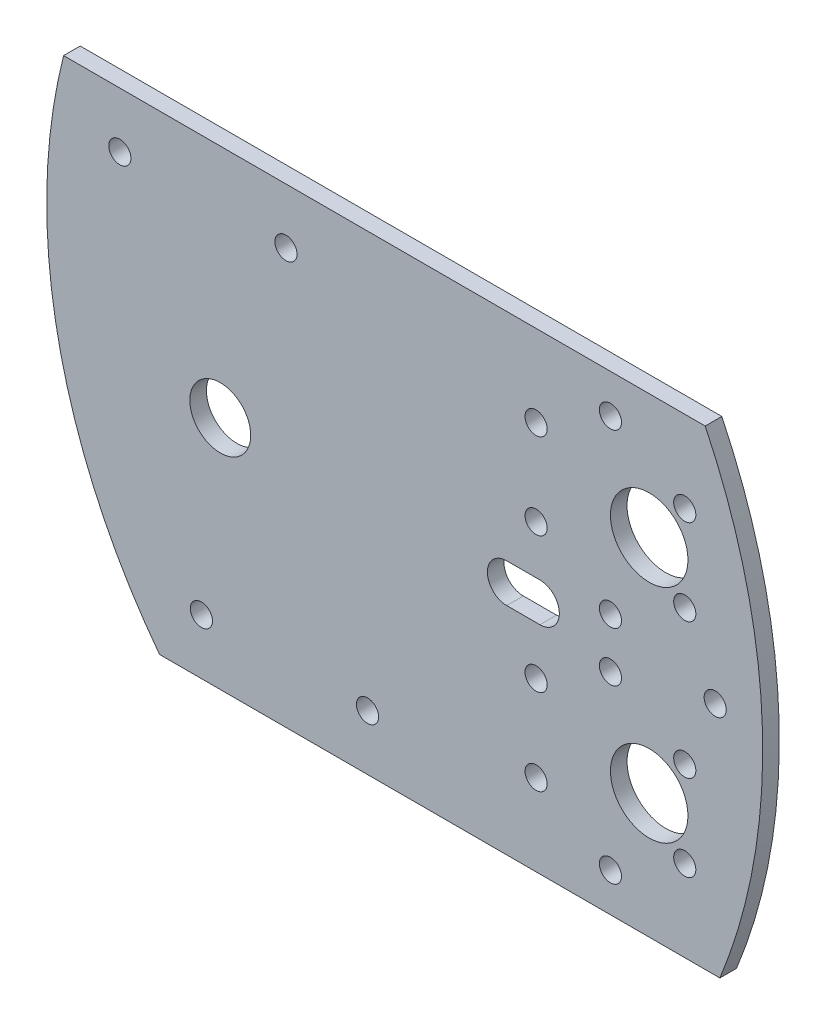
ISO-10303-21;
HEADER;
FILE_DESCRIPTION(('STEP AP214'),'2;1');
FILE_NAME('part.step','',(''),(''),'','','');
FILE_SCHEMA(('AUTOMOTIVE_DESIGN { 1 0 10303 214 1 1 1 1 }'));
ENDSEC;
DATA;
#1=APPLICATION_CONTEXT('core data for automotive mechanical design processes');
#2=APPLICATION_PROTOCOL_DEFINITION('international standard','automotive_design',2000,#1);
#3=PRODUCT_CONTEXT('',#1,'mechanical');
#4=PRODUCT('Part','Part','',(#3));
#5=PRODUCT_RELATED_PRODUCT_CATEGORY('part','',(#4));
#6=PRODUCT_DEFINITION_FORMATION('','',#4);
#7=PRODUCT_DEFINITION_CONTEXT('part definition',#1,'design');
#8=PRODUCT_DEFINITION('design','',#6,#7);
#9=PRODUCT_DEFINITION_SHAPE('','',#8);
#10=(LENGTH_UNIT() NAMED_UNIT(*) SI_UNIT(.MILLI.,.METRE.));
#11=(NAMED_UNIT(*) PLANE_ANGLE_UNIT() SI_UNIT($,.RADIAN.));
#12=(NAMED_UNIT(*) SI_UNIT($,.STERADIAN.) SOLID_ANGLE_UNIT());
#13=UNCERTAINTY_MEASURE_WITH_UNIT(LENGTH_MEASURE(1.E-05),#10,'distance_accuracy_value','');
#14=(GEOMETRIC_REPRESENTATION_CONTEXT(3) GLOBAL_UNCERTAINTY_ASSIGNED_CONTEXT((#13)) GLOBAL_UNIT_ASSIGNED_CONTEXT((#10,
#11,#12)) REPRESENTATION_CONTEXT('',''));
#15=CARTESIAN_POINT('',(0.,0.,0.));
#16=DIRECTION('',(0.,0.,1.));
#17=DIRECTION('',(1.,0.,0.));
#18=AXIS2_PLACEMENT_3D('',#15,#16,#17);
#19=CARTESIAN_POINT('',(87.2720779386423,0.,53.));
#20=DIRECTION('',(0.,0.,-1.));
#21=DIRECTION('',(-1.,0.,0.));
#22=AXIS2_PLACEMENT_3D('',#19,#20,#21);
#23=CYLINDRICAL_SURFACE('',#22,3.5);
#24=CARTESIAN_POINT('',(87.2720779386423,0.,50.));
#25=DIRECTION('',(0.,0.,1.));
#26=DIRECTION('',(1.,0.,0.));
#27=AXIS2_PLACEMENT_3D('',#24,#25,#26);
#28=CIRCLE('',#27,3.5);
#29=CARTESIAN_POINT('',(87.2720779386423,-3.5,50.));
#30=VERTEX_POINT('',#29);
#31=CARTESIAN_POINT('',(87.2720779386423,3.5,50.));
#32=VERTEX_POINT('',#31);
#33=EDGE_CURVE('E202',#30,#32,#28,.T.);
#34=ORIENTED_EDGE('',*,*,#33,.F.);
#35=DIRECTION('',(0.,0.,-1.));
#36=VECTOR('',#35,1.);
#37=CARTESIAN_POINT('',(87.2720779386423,-3.5,53.));
#38=LINE('',#37,#36);
#39=CARTESIAN_POINT('',(87.2720779386423,-3.5,53.));
#40=VERTEX_POINT('',#39);
#41=EDGE_CURVE('E11',#40,#30,#38,.T.);
#42=ORIENTED_EDGE('',*,*,#41,.F.);
#43=CARTESIAN_POINT('',(87.2720779386423,0.,53.));
#44=DIRECTION('',(0.,0.,1.));
#45=DIRECTION('',(1.,0.,0.));
#46=AXIS2_PLACEMENT_3D('',#43,#44,#45);
#47=CIRCLE('',#46,3.5);
#48=CARTESIAN_POINT('',(87.2720779386423,3.5,53.));
#49=VERTEX_POINT('',#48);
#50=EDGE_CURVE('E125',#40,#49,#47,.T.);
#51=ORIENTED_EDGE('',*,*,#50,.T.);
#52=DIRECTION('',(0.,0.,-1.));
#53=VECTOR('',#52,1.);
#54=CARTESIAN_POINT('',(87.2720779386423,3.5,53.));
#55=LINE('',#54,#53);
#56=EDGE_CURVE('E88',#49,#32,#55,.T.);
#57=ORIENTED_EDGE('',*,*,#56,.T.);
#58=EDGE_LOOP('',(#34,#42,#51,#57));
#59=FACE_BOUND('',#58,.T.);
#60=ADVANCED_FACE('F35',(#59),#23,.F.);
#61=CARTESIAN_POINT('',(0.,-3.5,53.));
#62=DIRECTION('',(0.,1.,0.));
#63=DIRECTION('',(0.,0.,1.));
#64=AXIS2_PLACEMENT_3D('',#61,#62,#63);
#65=PLANE('',#64);
#66=DIRECTION('',(1.,0.,0.));
#67=VECTOR('',#66,1.);
#68=CARTESIAN_POINT('',(0.,-3.5,50.));
#69=LINE('',#68,#67);
#70=CARTESIAN_POINT('',(81.2720779386423,-3.5,50.));
#71=VERTEX_POINT('',#70);
#72=EDGE_CURVE('E116',#71,#30,#69,.T.);
#73=ORIENTED_EDGE('',*,*,#72,.F.);
#74=DIRECTION('',(0.,0.,-1.));
#75=VECTOR('',#74,1.);
#76=CARTESIAN_POINT('',(81.2720779386423,-3.5,53.));
#77=LINE('',#76,#75);
#78=CARTESIAN_POINT('',(81.2720779386423,-3.5,53.));
#79=VERTEX_POINT('',#78);
#80=EDGE_CURVE('E45',#79,#71,#77,.T.);
#81=ORIENTED_EDGE('',*,*,#80,.F.);
#82=DIRECTION('',(1.,0.,0.));
#83=VECTOR('',#82,1.);
#84=CARTESIAN_POINT('',(0.,-3.5,53.));
#85=LINE('',#84,#83);
#86=EDGE_CURVE('E114',#79,#40,#85,.T.);
#87=ORIENTED_EDGE('',*,*,#86,.T.);
#88=ORIENTED_EDGE('',*,*,#41,.T.);
#89=EDGE_LOOP('',(#73,#81,#87,#88));
#90=FACE_BOUND('',#89,.T.);
#91=ADVANCED_FACE('F113',(#90),#65,.T.);
#92=CARTESIAN_POINT('',(81.2720779386423,0.,53.));
#93=DIRECTION('',(0.,0.,-1.));
#94=DIRECTION('',(-1.,0.,0.));
#95=AXIS2_PLACEMENT_3D('',#92,#93,#94);
#96=CYLINDRICAL_SURFACE('',#95,3.5);
#97=CARTESIAN_POINT('',(81.2720779386423,0.,50.));
#98=DIRECTION('',(0.,0.,1.));
#99=DIRECTION('',(1.,0.,0.));
#100=AXIS2_PLACEMENT_3D('',#97,#98,#99);
#101=CIRCLE('',#100,3.5);
#102=CARTESIAN_POINT('',(81.2720779386423,3.5,50.));
#103=VERTEX_POINT('',#102);
#104=EDGE_CURVE('E206',#103,#71,#101,.T.);
#105=ORIENTED_EDGE('',*,*,#104,.F.);
#106=DIRECTION('',(0.,0.,-1.));
#107=VECTOR('',#106,1.);
#108=CARTESIAN_POINT('',(81.2720779386423,3.5,53.));
#109=LINE('',#108,#107);
#110=CARTESIAN_POINT('',(81.2720779386423,3.5,53.));
#111=VERTEX_POINT('',#110);
#112=EDGE_CURVE('E81',#111,#103,#109,.T.);
#113=ORIENTED_EDGE('',*,*,#112,.F.);
#114=CARTESIAN_POINT('',(81.2720779386423,0.,53.));
#115=DIRECTION('',(0.,0.,1.));
#116=DIRECTION('',(1.,0.,0.));
#117=AXIS2_PLACEMENT_3D('',#114,#115,#116);
#118=CIRCLE('',#117,3.5);
#119=EDGE_CURVE('E124',#111,#79,#118,.T.);
#120=ORIENTED_EDGE('',*,*,#119,.T.);
#121=ORIENTED_EDGE('',*,*,#80,.T.);
#122=EDGE_LOOP('',(#105,#113,#120,#121));
#123=FACE_BOUND('',#122,.T.);
#124=ADVANCED_FACE('F127',(#123),#96,.F.);
#125=CARTESIAN_POINT('',(0.,-42.5,53.));
#126=DIRECTION('',(0.,1.,0.));
#127=DIRECTION('',(-1.,0.,0.));
#128=AXIS2_PLACEMENT_3D('',#125,#126,#127);
#129=PLANE('',#128);
#130=DIRECTION('',(1.,0.,0.));
#131=VECTOR('',#130,1.);
#132=CARTESIAN_POINT('',(0.,-42.5,50.));
#133=LINE('',#132,#131);
#134=CARTESIAN_POINT('',(18.5774529420215,-42.5,50.));
#135=VERTEX_POINT('',#134);
#136=CARTESIAN_POINT('',(119.771431791704,-42.5000000000001,50.));
#137=VERTEX_POINT('',#136);
#138=EDGE_CURVE('E193',#135,#137,#133,.T.);
#139=ORIENTED_EDGE('',*,*,#138,.T.);
#140=DIRECTION('',(0.,0.,-1.));
#141=VECTOR('',#140,1.);
#142=CARTESIAN_POINT('',(119.771431791704,-42.5000000000001,53.));
#143=LINE('',#142,#141);
#144=CARTESIAN_POINT('',(119.771431791704,-42.5000000000001,53.));
#145=VERTEX_POINT('',#144);
#146=EDGE_CURVE('E39',#145,#137,#143,.T.);
#147=ORIENTED_EDGE('',*,*,#146,.F.);
#148=DIRECTION('',(1.,0.,0.));
#149=VECTOR('',#148,1.);
#150=CARTESIAN_POINT('',(0.,-42.5,53.));
#151=LINE('',#150,#149);
#152=CARTESIAN_POINT('',(18.5774529420215,-42.5,53.));
#153=VERTEX_POINT('',#152);
#154=EDGE_CURVE('E296',#153,#145,#151,.T.);
#155=ORIENTED_EDGE('',*,*,#154,.F.);
#156=DIRECTION('',(0.,0.,-1.));
#157=VECTOR('',#156,1.);
#158=CARTESIAN_POINT('',(18.5774529420215,-42.5,53.));
#159=LINE('',#158,#157);
#160=EDGE_CURVE('E183',#153,#135,#159,.T.);
#161=ORIENTED_EDGE('',*,*,#160,.T.);
#162=EDGE_LOOP('',(#139,#147,#155,#161));
#163=FACE_BOUND('',#162,.T.);
#164=ADVANCED_FACE('F278',(#163),#129,.F.);
#165=CARTESIAN_POINT('',(22.6589151875398,-2.99288439458776,53.));
#166=DIRECTION('',(0.,0.,-1.));
#167=DIRECTION('',(-1.,0.,0.));
#168=AXIS2_PLACEMENT_3D('',#165,#166,#167);
#169=CYLINDRICAL_SURFACE('',#168,104.84108481246);
#170=CARTESIAN_POINT('',(22.6589151875398,-2.99288439458776,50.));
#171=DIRECTION('',(0.,0.,1.));
#172=DIRECTION('',(1.,0.,0.));
#173=AXIS2_PLACEMENT_3D('',#170,#171,#172);
#174=CIRCLE('',#173,104.84108481246);
#175=CARTESIAN_POINT('',(117.115521807268,42.5,50.));
#176=VERTEX_POINT('',#175);
#177=EDGE_CURVE('E196',#137,#176,#174,.T.);
#178=ORIENTED_EDGE('',*,*,#177,.T.);
#179=DIRECTION('',(0.,0.,-1.));
#180=VECTOR('',#179,1.);
#181=CARTESIAN_POINT('',(117.115521807268,42.5,53.));
#182=LINE('',#181,#180);
#183=CARTESIAN_POINT('',(117.115521807268,42.5,53.));
#184=VERTEX_POINT('',#183);
#185=EDGE_CURVE('E268',#184,#176,#182,.T.);
#186=ORIENTED_EDGE('',*,*,#185,.F.);
#187=CARTESIAN_POINT('',(22.6589151875398,-2.99288439458776,53.));
#188=DIRECTION('',(0.,0.,1.));
#189=DIRECTION('',(1.,0.,0.));
#190=AXIS2_PLACEMENT_3D('',#187,#188,#189);
#191=CIRCLE('',#190,104.84108481246);
#192=EDGE_CURVE('E96',#145,#184,#191,.T.);
#193=ORIENTED_EDGE('',*,*,#192,.F.);
#194=ORIENTED_EDGE('',*,*,#146,.T.);
#195=EDGE_LOOP('',(#178,#186,#193,#194));
#196=FACE_BOUND('',#195,.T.);
#197=ADVANCED_FACE('F274',(#196),#169,.T.);
#198=CARTESIAN_POINT('',(0.,42.5,53.));
#199=DIRECTION('',(0.,-1.,0.));
#200=DIRECTION('',(1.,0.,0.));
#201=AXIS2_PLACEMENT_3D('',#198,#199,#200);
#202=PLANE('',#201);
#203=DIRECTION('',(-1.,0.,0.));
#204=VECTOR('',#203,1.);
#205=CARTESIAN_POINT('',(0.,42.5,50.));
#206=LINE('',#205,#204);
#207=CARTESIAN_POINT('',(1.24769213680372,42.5,50.));
#208=VERTEX_POINT('',#207);
#209=EDGE_CURVE('E198',#176,#208,#206,.T.);
#210=ORIENTED_EDGE('',*,*,#209,.T.);
#211=DIRECTION('',(0.,0.,-1.));
#212=VECTOR('',#211,1.);
#213=CARTESIAN_POINT('',(1.24769213680372,42.5,53.));
#214=LINE('',#213,#212);
#215=CARTESIAN_POINT('',(1.24769213680372,42.5,53.));
#216=VERTEX_POINT('',#215);
#217=EDGE_CURVE('E266',#216,#208,#214,.T.);
#218=ORIENTED_EDGE('',*,*,#217,.F.);
#219=DIRECTION('',(-1.,0.,0.));
#220=VECTOR('',#219,1.);
#221=CARTESIAN_POINT('',(0.,42.5,53.));
#222=LINE('',#221,#220);
#223=EDGE_CURVE('E291',#184,#216,#222,.T.);
#224=ORIENTED_EDGE('',*,*,#223,.F.);
#225=ORIENTED_EDGE('',*,*,#185,.T.);
#226=EDGE_LOOP('',(#210,#218,#224,#225));
#227=FACE_BOUND('',#226,.T.);
#228=ADVANCED_FACE('F285',(#227),#202,.F.);
#229=CARTESIAN_POINT('',(100.,4.50000000000001,53.));
#230=DIRECTION('',(0.,0.,-1.));
#231=DIRECTION('',(-1.,0.,0.));
#232=AXIS2_PLACEMENT_3D('',#229,#230,#231);
#233=CYLINDRICAL_SURFACE('',#232,2.);
#234=CARTESIAN_POINT('',(100.,4.50000000000001,53.));
#235=DIRECTION('',(0.,0.,1.));
#236=DIRECTION('',(1.,0.,0.));
#237=AXIS2_PLACEMENT_3D('',#234,#235,#236);
#238=CIRCLE('',#237,2.);
#239=CARTESIAN_POINT('',(102.,4.50000000000001,53.));
#240=VERTEX_POINT('',#239);
#241=EDGE_CURVE('E177',#240,#240,#238,.T.);
#242=ORIENTED_EDGE('',*,*,#241,.T.);
#243=EDGE_LOOP('',(#242));
#244=FACE_BOUND('',#243,.T.);
#245=CARTESIAN_POINT('',(100.,4.50000000000001,50.));
#246=DIRECTION('',(0.,0.,1.));
#247=DIRECTION('',(1.,0.,0.));
#248=AXIS2_PLACEMENT_3D('',#245,#246,#247);
#249=CIRCLE('',#248,2.);
#250=CARTESIAN_POINT('',(102.,4.50000000000001,50.));
#251=VERTEX_POINT('',#250);
#252=EDGE_CURVE('E255',#251,#251,#249,.T.);
#253=ORIENTED_EDGE('',*,*,#252,.F.);
#254=EDGE_LOOP('',(#253));
#255=FACE_BOUND('',#254,.T.);
#256=ADVANCED_FACE('F344',(#244,#255),#233,.F.);
#257=CARTESIAN_POINT('',(86.5766062413412,27.7499999999999,53.));
#258=DIRECTION('',(0.,0.,-1.));
#259=DIRECTION('',(-1.,0.,0.));
#260=AXIS2_PLACEMENT_3D('',#257,#258,#259);
#261=CYLINDRICAL_SURFACE('',#260,2.);
#262=CARTESIAN_POINT('',(86.5766062413412,27.7499999999999,53.));
#263=DIRECTION('',(0.,0.,1.));
#264=DIRECTION('',(1.,0.,0.));
#265=AXIS2_PLACEMENT_3D('',#262,#263,#264);
#266=CIRCLE('',#265,2.);
#267=CARTESIAN_POINT('',(88.5766062413412,27.7499999999999,53.));
#268=VERTEX_POINT('',#267);
#269=EDGE_CURVE('E174',#268,#268,#266,.T.);
#270=ORIENTED_EDGE('',*,*,#269,.T.);
#271=EDGE_LOOP('',(#270));
#272=FACE_BOUND('',#271,.T.);
#273=CARTESIAN_POINT('',(86.5766062413412,27.7499999999999,50.));
#274=DIRECTION('',(0.,0.,1.));
#275=DIRECTION('',(1.,0.,0.));
#276=AXIS2_PLACEMENT_3D('',#273,#274,#275);
#277=CIRCLE('',#276,2.);
#278=CARTESIAN_POINT('',(88.5766062413412,27.7499999999999,50.));
#279=VERTEX_POINT('',#278);
#280=EDGE_CURVE('E252',#279,#279,#277,.T.);
#281=ORIENTED_EDGE('',*,*,#280,.F.);
#282=EDGE_LOOP('',(#281));
#283=FACE_BOUND('',#282,.T.);
#284=ADVANCED_FACE('F365',(#272,#283),#261,.F.);
#285=CARTESIAN_POINT('',(86.5766062413413,12.2499999999999,53.));
#286=DIRECTION('',(0.,0.,-1.));
#287=DIRECTION('',(-1.,0.,0.));
#288=AXIS2_PLACEMENT_3D('',#285,#286,#287);
#289=CYLINDRICAL_SURFACE('',#288,2.);
#290=CARTESIAN_POINT('',(86.5766062413413,12.2499999999999,53.));
#291=DIRECTION('',(0.,0.,1.));
#292=DIRECTION('',(1.,0.,0.));
#293=AXIS2_PLACEMENT_3D('',#290,#291,#292);
#294=CIRCLE('',#293,2.);
#295=CARTESIAN_POINT('',(88.5766062413413,12.2499999999999,53.));
#296=VERTEX_POINT('',#295);
#297=EDGE_CURVE('E171',#296,#296,#294,.T.);
#298=ORIENTED_EDGE('',*,*,#297,.T.);
#299=EDGE_LOOP('',(#298));
#300=FACE_BOUND('',#299,.T.);
#301=CARTESIAN_POINT('',(86.5766062413413,12.2499999999999,50.));
#302=DIRECTION('',(0.,0.,1.));
#303=DIRECTION('',(1.,0.,0.));
#304=AXIS2_PLACEMENT_3D('',#301,#302,#303);
#305=CIRCLE('',#304,2.);
#306=CARTESIAN_POINT('',(88.5766062413413,12.2499999999999,50.));
#307=VERTEX_POINT('',#306);
#308=EDGE_CURVE('E249',#307,#307,#305,.T.);
#309=ORIENTED_EDGE('',*,*,#308,.F.);
#310=EDGE_LOOP('',(#309));
#311=FACE_BOUND('',#310,.T.);
#312=ADVANCED_FACE('F369',(#300,#311),#289,.F.);
#313=CARTESIAN_POINT('',(99.9999999999999,35.5,53.));
#314=DIRECTION('',(0.,0.,-1.));
#315=DIRECTION('',(-1.,0.,0.));
#316=AXIS2_PLACEMENT_3D('',#313,#314,#315);
#317=CYLINDRICAL_SURFACE('',#316,2.);
#318=CARTESIAN_POINT('',(99.9999999999999,35.5,53.));
#319=DIRECTION('',(0.,0.,1.));
#320=DIRECTION('',(1.,0.,0.));
#321=AXIS2_PLACEMENT_3D('',#318,#319,#320);
#322=CIRCLE('',#321,2.);
#323=CARTESIAN_POINT('',(102.,35.5,53.));
#324=VERTEX_POINT('',#323);
#325=EDGE_CURVE('E168',#324,#324,#322,.T.);
#326=ORIENTED_EDGE('',*,*,#325,.T.);
#327=EDGE_LOOP('',(#326));
#328=FACE_BOUND('',#327,.T.);
#329=CARTESIAN_POINT('',(99.9999999999999,35.5,50.));
#330=DIRECTION('',(0.,0.,1.));
#331=DIRECTION('',(1.,0.,0.));
#332=AXIS2_PLACEMENT_3D('',#329,#330,#331);
#333=CIRCLE('',#332,2.);
#334=CARTESIAN_POINT('',(102.,35.5,50.));
#335=VERTEX_POINT('',#334);
#336=EDGE_CURVE('E246',#335,#335,#333,.T.);
#337=ORIENTED_EDGE('',*,*,#336,.F.);
#338=EDGE_LOOP('',(#337));
#339=FACE_BOUND('',#338,.T.);
#340=ADVANCED_FACE('F373',(#328,#339),#317,.F.);
#341=CARTESIAN_POINT('',(113.423393758659,27.7500000000001,53.));
#342=DIRECTION('',(0.,0.,-1.));
#343=DIRECTION('',(-1.,0.,0.));
#344=AXIS2_PLACEMENT_3D('',#341,#342,#343);
#345=CYLINDRICAL_SURFACE('',#344,2.);
#346=CARTESIAN_POINT('',(113.423393758659,27.7500000000001,53.));
#347=DIRECTION('',(0.,0.,1.));
#348=DIRECTION('',(1.,0.,0.));
#349=AXIS2_PLACEMENT_3D('',#346,#347,#348);
#350=CIRCLE('',#349,2.);
#351=CARTESIAN_POINT('',(115.423393758659,27.7500000000001,53.));
#352=VERTEX_POINT('',#351);
#353=EDGE_CURVE('E165',#352,#352,#350,.T.);
#354=ORIENTED_EDGE('',*,*,#353,.T.);
#355=EDGE_LOOP('',(#354));
#356=FACE_BOUND('',#355,.T.);
#357=CARTESIAN_POINT('',(113.423393758659,27.7500000000001,50.));
#358=DIRECTION('',(0.,0.,1.));
#359=DIRECTION('',(1.,0.,0.));
#360=AXIS2_PLACEMENT_3D('',#357,#358,#359);
#361=CIRCLE('',#360,2.);
#362=CARTESIAN_POINT('',(115.423393758659,27.7500000000001,50.));
#363=VERTEX_POINT('',#362);
#364=EDGE_CURVE('E243',#363,#363,#361,.T.);
#365=ORIENTED_EDGE('',*,*,#364,.F.);
#366=EDGE_LOOP('',(#365));
#367=FACE_BOUND('',#366,.T.);
#368=ADVANCED_FACE('F377',(#356,#367),#345,.F.);
#369=CARTESIAN_POINT('',(107.,20.,53.));
#370=DIRECTION('',(0.,0.,-1.));
#371=DIRECTION('',(-1.,0.,0.));
#372=AXIS2_PLACEMENT_3D('',#369,#370,#371);
#373=CYLINDRICAL_SURFACE('',#372,7.);
#374=CARTESIAN_POINT('',(107.,20.,53.));
#375=DIRECTION('',(0.,0.,1.));
#376=DIRECTION('',(1.,0.,0.));
#377=AXIS2_PLACEMENT_3D('',#374,#375,#376);
#378=CIRCLE('',#377,7.);
#379=CARTESIAN_POINT('',(114.,20.,53.));
#380=VERTEX_POINT('',#379);
#381=EDGE_CURVE('E162',#380,#380,#378,.T.);
#382=ORIENTED_EDGE('',*,*,#381,.T.);
#383=EDGE_LOOP('',(#382));
#384=FACE_BOUND('',#383,.T.);
#385=CARTESIAN_POINT('',(107.,20.,50.));
#386=DIRECTION('',(0.,0.,1.));
#387=DIRECTION('',(1.,0.,0.));
#388=AXIS2_PLACEMENT_3D('',#385,#386,#387);
#389=CIRCLE('',#388,7.);
#390=CARTESIAN_POINT('',(114.,20.,50.));
#391=VERTEX_POINT('',#390);
#392=EDGE_CURVE('E240',#391,#391,#389,.T.);
#393=ORIENTED_EDGE('',*,*,#392,.F.);
#394=EDGE_LOOP('',(#393));
#395=FACE_BOUND('',#394,.T.);
#396=ADVANCED_FACE('F381',(#384,#395),#373,.F.);
#397=CARTESIAN_POINT('',(107.,-20.,53.));
#398=DIRECTION('',(0.,0.,-1.));
#399=DIRECTION('',(-1.,0.,0.));
#400=AXIS2_PLACEMENT_3D('',#397,#398,#399);
#401=CYLINDRICAL_SURFACE('',#400,7.);
#402=CARTESIAN_POINT('',(107.,-20.,53.));
#403=DIRECTION('',(0.,0.,1.));
#404=DIRECTION('',(1.,0.,0.));
#405=AXIS2_PLACEMENT_3D('',#402,#403,#404);
#406=CIRCLE('',#405,7.);
#407=CARTESIAN_POINT('',(114.,-20.,53.));
#408=VERTEX_POINT('',#407);
#409=EDGE_CURVE('E159',#408,#408,#406,.T.);
#410=ORIENTED_EDGE('',*,*,#409,.T.);
#411=EDGE_LOOP('',(#410));
#412=FACE_BOUND('',#411,.T.);
#413=CARTESIAN_POINT('',(107.,-20.,50.));
#414=DIRECTION('',(0.,0.,1.));
#415=DIRECTION('',(1.,0.,0.));
#416=AXIS2_PLACEMENT_3D('',#413,#414,#415);
#417=CIRCLE('',#416,7.);
#418=CARTESIAN_POINT('',(114.,-20.,50.));
#419=VERTEX_POINT('',#418);
#420=EDGE_CURVE('E237',#419,#419,#417,.T.);
#421=ORIENTED_EDGE('',*,*,#420,.F.);
#422=EDGE_LOOP('',(#421));
#423=FACE_BOUND('',#422,.T.);
#424=ADVANCED_FACE('F385',(#412,#423),#401,.F.);
#425=CARTESIAN_POINT('',(100.,-35.5,53.));
#426=DIRECTION('',(0.,0.,-1.));
#427=DIRECTION('',(-1.,0.,0.));
#428=AXIS2_PLACEMENT_3D('',#425,#426,#427);
#429=CYLINDRICAL_SURFACE('',#428,2.);
#430=CARTESIAN_POINT('',(100.,-35.5,53.));
#431=DIRECTION('',(0.,0.,1.));
#432=DIRECTION('',(1.,0.,0.));
#433=AXIS2_PLACEMENT_3D('',#430,#431,#432);
#434=CIRCLE('',#433,2.);
#435=CARTESIAN_POINT('',(102.,-35.5,53.));
#436=VERTEX_POINT('',#435);
#437=EDGE_CURVE('E156',#436,#436,#434,.T.);
#438=ORIENTED_EDGE('',*,*,#437,.T.);
#439=EDGE_LOOP('',(#438));
#440=FACE_BOUND('',#439,.T.);
#441=CARTESIAN_POINT('',(100.,-35.5,50.));
#442=DIRECTION('',(0.,0.,1.));
#443=DIRECTION('',(1.,0.,0.));
#444=AXIS2_PLACEMENT_3D('',#441,#442,#443);
#445=CIRCLE('',#444,2.);
#446=CARTESIAN_POINT('',(102.,-35.5,50.));
#447=VERTEX_POINT('',#446);
#448=EDGE_CURVE('E234',#447,#447,#445,.T.);
#449=ORIENTED_EDGE('',*,*,#448,.F.);
#450=EDGE_LOOP('',(#449));
#451=FACE_BOUND('',#450,.T.);
#452=ADVANCED_FACE('F389',(#440,#451),#429,.F.);
#453=CARTESIAN_POINT('',(86.5766062413413,-27.7500000000001,53.));
#454=DIRECTION('',(0.,0.,-1.));
#455=DIRECTION('',(-1.,0.,0.));
#456=AXIS2_PLACEMENT_3D('',#453,#454,#455);
#457=CYLINDRICAL_SURFACE('',#456,2.);
#458=CARTESIAN_POINT('',(86.5766062413413,-27.7500000000001,53.));
#459=DIRECTION('',(0.,0.,1.));
#460=DIRECTION('',(1.,0.,0.));
#461=AXIS2_PLACEMENT_3D('',#458,#459,#460);
#462=CIRCLE('',#461,2.);
#463=CARTESIAN_POINT('',(88.5766062413413,-27.7500000000001,53.));
#464=VERTEX_POINT('',#463);
#465=EDGE_CURVE('E153',#464,#464,#462,.T.);
#466=ORIENTED_EDGE('',*,*,#465,.T.);
#467=EDGE_LOOP('',(#466));
#468=FACE_BOUND('',#467,.T.);
#469=CARTESIAN_POINT('',(86.5766062413413,-27.7500000000001,50.));
#470=DIRECTION('',(0.,0.,1.));
#471=DIRECTION('',(1.,0.,0.));
#472=AXIS2_PLACEMENT_3D('',#469,#470,#471);
#473=CIRCLE('',#472,2.);
#474=CARTESIAN_POINT('',(88.5766062413413,-27.7500000000001,50.));
#475=VERTEX_POINT('',#474);
#476=EDGE_CURVE('E231',#475,#475,#473,.T.);
#477=ORIENTED_EDGE('',*,*,#476,.F.);
#478=EDGE_LOOP('',(#477));
#479=FACE_BOUND('',#478,.T.);
#480=ADVANCED_FACE('F393',(#468,#479),#457,.F.);
#481=CARTESIAN_POINT('',(86.5766062413412,-12.2500000000001,53.));
#482=DIRECTION('',(0.,0.,-1.));
#483=DIRECTION('',(-1.,0.,0.));
#484=AXIS2_PLACEMENT_3D('',#481,#482,#483);
#485=CYLINDRICAL_SURFACE('',#484,2.);
#486=CARTESIAN_POINT('',(86.5766062413412,-12.2500000000001,53.));
#487=DIRECTION('',(0.,0.,1.));
#488=DIRECTION('',(1.,0.,0.));
#489=AXIS2_PLACEMENT_3D('',#486,#487,#488);
#490=CIRCLE('',#489,2.);
#491=CARTESIAN_POINT('',(88.5766062413412,-12.2500000000001,53.));
#492=VERTEX_POINT('',#491);
#493=EDGE_CURVE('E150',#492,#492,#490,.T.);
#494=ORIENTED_EDGE('',*,*,#493,.T.);
#495=EDGE_LOOP('',(#494));
#496=FACE_BOUND('',#495,.T.);
#497=CARTESIAN_POINT('',(86.5766062413412,-12.2500000000001,50.));
#498=DIRECTION('',(0.,0.,1.));
#499=DIRECTION('',(1.,0.,0.));
#500=AXIS2_PLACEMENT_3D('',#497,#498,#499);
#501=CIRCLE('',#500,2.);
#502=CARTESIAN_POINT('',(88.5766062413412,-12.2500000000001,50.));
#503=VERTEX_POINT('',#502);
#504=EDGE_CURVE('E228',#503,#503,#501,.T.);
#505=ORIENTED_EDGE('',*,*,#504,.F.);
#506=EDGE_LOOP('',(#505));
#507=FACE_BOUND('',#506,.T.);
#508=ADVANCED_FACE('F397',(#496,#507),#485,.F.);
#509=CARTESIAN_POINT('',(99.9999999999999,-4.5,53.));
#510=DIRECTION('',(0.,0.,-1.));
#511=DIRECTION('',(-1.,0.,0.));
#512=AXIS2_PLACEMENT_3D('',#509,#510,#511);
#513=CYLINDRICAL_SURFACE('',#512,2.);
#514=CARTESIAN_POINT('',(99.9999999999999,-4.5,53.));
#515=DIRECTION('',(0.,0.,1.));
#516=DIRECTION('',(1.,0.,0.));
#517=AXIS2_PLACEMENT_3D('',#514,#515,#516);
#518=CIRCLE('',#517,2.);
#519=CARTESIAN_POINT('',(102.,-4.5,53.));
#520=VERTEX_POINT('',#519);
#521=EDGE_CURVE('E147',#520,#520,#518,.T.);
#522=ORIENTED_EDGE('',*,*,#521,.T.);
#523=EDGE_LOOP('',(#522));
#524=FACE_BOUND('',#523,.T.);
#525=CARTESIAN_POINT('',(99.9999999999999,-4.5,50.));
#526=DIRECTION('',(0.,0.,1.));
#527=DIRECTION('',(1.,0.,0.));
#528=AXIS2_PLACEMENT_3D('',#525,#526,#527);
#529=CIRCLE('',#528,2.);
#530=CARTESIAN_POINT('',(102.,-4.5,50.));
#531=VERTEX_POINT('',#530);
#532=EDGE_CURVE('E225',#531,#531,#529,.T.);
#533=ORIENTED_EDGE('',*,*,#532,.F.);
#534=EDGE_LOOP('',(#533));
#535=FACE_BOUND('',#534,.T.);
#536=ADVANCED_FACE('F401',(#524,#535),#513,.F.);
#537=CARTESIAN_POINT('',(113.423393758659,-12.2499999999999,53.));
#538=DIRECTION('',(0.,0.,-1.));
#539=DIRECTION('',(-1.,0.,0.));
#540=AXIS2_PLACEMENT_3D('',#537,#538,#539);
#541=CYLINDRICAL_SURFACE('',#540,2.);
#542=CARTESIAN_POINT('',(113.423393758659,-12.2499999999999,53.));
#543=DIRECTION('',(0.,0.,1.));
#544=DIRECTION('',(1.,0.,0.));
#545=AXIS2_PLACEMENT_3D('',#542,#543,#544);
#546=CIRCLE('',#545,2.);
#547=CARTESIAN_POINT('',(115.423393758659,-12.2499999999999,53.));
#548=VERTEX_POINT('',#547);
#549=EDGE_CURVE('E144',#548,#548,#546,.T.);
#550=ORIENTED_EDGE('',*,*,#549,.T.);
#551=EDGE_LOOP('',(#550));
#552=FACE_BOUND('',#551,.T.);
#553=CARTESIAN_POINT('',(113.423393758659,-12.2499999999999,50.));
#554=DIRECTION('',(0.,0.,1.));
#555=DIRECTION('',(1.,0.,0.));
#556=AXIS2_PLACEMENT_3D('',#553,#554,#555);
#557=CIRCLE('',#556,2.);
#558=CARTESIAN_POINT('',(115.423393758659,-12.2499999999999,50.));
#559=VERTEX_POINT('',#558);
#560=EDGE_CURVE('E222',#559,#559,#557,.T.);
#561=ORIENTED_EDGE('',*,*,#560,.F.);
#562=EDGE_LOOP('',(#561));
#563=FACE_BOUND('',#562,.T.);
#564=ADVANCED_FACE('F405',(#552,#563),#541,.F.);
#565=CARTESIAN_POINT('',(113.423393758659,-27.7499999999999,53.));
#566=DIRECTION('',(0.,0.,-1.));
#567=DIRECTION('',(-1.,0.,0.));
#568=AXIS2_PLACEMENT_3D('',#565,#566,#567);
#569=CYLINDRICAL_SURFACE('',#568,2.);
#570=CARTESIAN_POINT('',(113.423393758659,-27.7499999999999,53.));
#571=DIRECTION('',(0.,0.,1.));
#572=DIRECTION('',(1.,0.,0.));
#573=AXIS2_PLACEMENT_3D('',#570,#571,#572);
#574=CIRCLE('',#573,2.);
#575=CARTESIAN_POINT('',(115.423393758659,-27.7499999999999,53.));
#576=VERTEX_POINT('',#575);
#577=EDGE_CURVE('E141',#576,#576,#574,.T.);
#578=ORIENTED_EDGE('',*,*,#577,.T.);
#579=EDGE_LOOP('',(#578));
#580=FACE_BOUND('',#579,.T.);
#581=CARTESIAN_POINT('',(113.423393758659,-27.7499999999999,50.));
#582=DIRECTION('',(0.,0.,1.));
#583=DIRECTION('',(1.,0.,0.));
#584=AXIS2_PLACEMENT_3D('',#581,#582,#583);
#585=CIRCLE('',#584,2.);
#586=CARTESIAN_POINT('',(115.423393758659,-27.7499999999999,50.));
#587=VERTEX_POINT('',#586);
#588=EDGE_CURVE('E219',#587,#587,#585,.T.);
#589=ORIENTED_EDGE('',*,*,#588,.F.);
#590=EDGE_LOOP('',(#589));
#591=FACE_BOUND('',#590,.T.);
#592=ADVANCED_FACE('F409',(#580,#591),#569,.F.);
#593=CARTESIAN_POINT('',(29.5403330758517,0.,53.));
#594=DIRECTION('',(0.,0.,-1.));
#595=DIRECTION('',(-1.,0.,0.));
#596=AXIS2_PLACEMENT_3D('',#593,#594,#595);
#597=CYLINDRICAL_SURFACE('',#596,5.5);
#598=CARTESIAN_POINT('',(29.5403330758517,0.,53.));
#599=DIRECTION('',(0.,0.,1.));
#600=DIRECTION('',(1.,0.,0.));
#601=AXIS2_PLACEMENT_3D('',#598,#599,#600);
#602=CIRCLE('',#601,5.5);
#603=CARTESIAN_POINT('',(35.0403330758517,0.,53.));
#604=VERTEX_POINT('',#603);
#605=EDGE_CURVE('E138',#604,#604,#602,.T.);
#606=ORIENTED_EDGE('',*,*,#605,.T.);
#607=EDGE_LOOP('',(#606));
#608=FACE_BOUND('',#607,.T.);
#609=CARTESIAN_POINT('',(29.5403330758517,0.,50.));
#610=DIRECTION('',(0.,0.,1.));
#611=DIRECTION('',(1.,0.,0.));
#612=AXIS2_PLACEMENT_3D('',#609,#610,#611);
#613=CIRCLE('',#612,5.5);
#614=CARTESIAN_POINT('',(35.0403330758517,0.,50.));
#615=VERTEX_POINT('',#614);
#616=EDGE_CURVE('E216',#615,#615,#613,.T.);
#617=ORIENTED_EDGE('',*,*,#616,.F.);
#618=EDGE_LOOP('',(#617));
#619=FACE_BOUND('',#618,.T.);
#620=ADVANCED_FACE('F413',(#608,#619),#597,.F.);
#621=CARTESIAN_POINT('',(118.920788159888,0.,53.));
#622=DIRECTION('',(0.,0.,-1.));
#623=DIRECTION('',(-1.,0.,0.));
#624=AXIS2_PLACEMENT_3D('',#621,#622,#623);
#625=CYLINDRICAL_SURFACE('',#624,2.);
#626=CARTESIAN_POINT('',(118.920788159888,0.,53.));
#627=DIRECTION('',(0.,0.,1.));
#628=DIRECTION('',(1.,0.,0.));
#629=AXIS2_PLACEMENT_3D('',#626,#627,#628);
#630=CIRCLE('',#629,2.);
#631=CARTESIAN_POINT('',(120.920788159888,0.,53.));
#632=VERTEX_POINT('',#631);
#633=EDGE_CURVE('E135',#632,#632,#630,.T.);
#634=ORIENTED_EDGE('',*,*,#633,.T.);
#635=EDGE_LOOP('',(#634));
#636=FACE_BOUND('',#635,.T.);
#637=CARTESIAN_POINT('',(118.920788159888,0.,50.));
#638=DIRECTION('',(0.,0.,1.));
#639=DIRECTION('',(1.,0.,0.));
#640=AXIS2_PLACEMENT_3D('',#637,#638,#639);
#641=CIRCLE('',#640,2.);
#642=CARTESIAN_POINT('',(120.920788159888,0.,50.));
#643=VERTEX_POINT('',#642);
#644=EDGE_CURVE('E213',#643,#643,#641,.T.);
#645=ORIENTED_EDGE('',*,*,#644,.F.);
#646=EDGE_LOOP('',(#645));
#647=FACE_BOUND('',#646,.T.);
#648=ADVANCED_FACE('F417',(#636,#647),#625,.F.);
#649=CARTESIAN_POINT('',(56.1323234730022,-32.5,53.));
#650=DIRECTION('',(0.,0.,-1.));
#651=DIRECTION('',(-1.,0.,0.));
#652=AXIS2_PLACEMENT_3D('',#649,#650,#651);
#653=CYLINDRICAL_SURFACE('',#652,2.);
#654=CARTESIAN_POINT('',(56.1323234730022,-32.5,53.));
#655=DIRECTION('',(0.,0.,1.));
#656=DIRECTION('',(1.,0.,0.));
#657=AXIS2_PLACEMENT_3D('',#654,#655,#656);
#658=CIRCLE('',#657,2.);
#659=CARTESIAN_POINT('',(58.1323234730022,-32.5,53.));
#660=VERTEX_POINT('',#659);
#661=EDGE_CURVE('E129',#660,#660,#658,.T.);
#662=ORIENTED_EDGE('',*,*,#661,.T.);
#663=EDGE_LOOP('',(#662));
#664=FACE_BOUND('',#663,.T.);
#665=CARTESIAN_POINT('',(56.1323234730022,-32.5,50.));
#666=DIRECTION('',(0.,0.,1.));
#667=DIRECTION('',(1.,0.,0.));
#668=AXIS2_PLACEMENT_3D('',#665,#666,#667);
#669=CIRCLE('',#668,2.);
#670=CARTESIAN_POINT('',(58.1323234730022,-32.5,50.));
#671=VERTEX_POINT('',#670);
#672=EDGE_CURVE('E210',#671,#671,#669,.T.);
#673=ORIENTED_EDGE('',*,*,#672,.F.);
#674=EDGE_LOOP('',(#673));
#675=FACE_BOUND('',#674,.T.);
#676=ADVANCED_FACE('F421',(#664,#675),#653,.F.);
#677=CARTESIAN_POINT('',(0.,3.5,53.));
#678=DIRECTION('',(0.,1.,0.));
#679=DIRECTION('',(0.,0.,1.));
#680=AXIS2_PLACEMENT_3D('',#677,#678,#679);
#681=PLANE('',#680);
#682=DIRECTION('',(1.,0.,0.));
#683=VECTOR('',#682,1.);
#684=CARTESIAN_POINT('',(0.,3.5,50.));
#685=LINE('',#684,#683);
#686=EDGE_CURVE('E208',#103,#32,#685,.T.);
#687=ORIENTED_EDGE('',*,*,#686,.T.);
#688=ORIENTED_EDGE('',*,*,#56,.F.);
#689=DIRECTION('',(1.,0.,0.));
#690=VECTOR('',#689,1.);
#691=CARTESIAN_POINT('',(0.,3.5,53.));
#692=LINE('',#691,#690);
#693=EDGE_CURVE('E54',#111,#49,#692,.T.);
#694=ORIENTED_EDGE('',*,*,#693,.F.);
#695=ORIENTED_EDGE('',*,*,#112,.T.);
#696=EDGE_LOOP('',(#687,#688,#694,#695));
#697=FACE_BOUND('',#696,.T.);
#698=ADVANCED_FACE('F341',(#697),#681,.F.);
#699=CARTESIAN_POINT('',(98.2,18.,53.));
#700=DIRECTION('',(0.,0.,-1.));
#701=DIRECTION('',(-1.,0.,0.));
#702=AXIS2_PLACEMENT_3D('',#699,#700,#701);
#703=CYLINDRICAL_SURFACE('',#702,100.);
#704=CARTESIAN_POINT('',(98.2,18.,50.));
#705=DIRECTION('',(0.,0.,1.));
#706=DIRECTION('',(1.,0.,0.));
#707=AXIS2_PLACEMENT_3D('',#704,#705,#706);
#708=CIRCLE('',#707,100.);
#709=EDGE_CURVE('E200',#208,#135,#708,.T.);
#710=ORIENTED_EDGE('',*,*,#709,.T.);
#711=ORIENTED_EDGE('',*,*,#160,.F.);
#712=CARTESIAN_POINT('',(98.2,18.,53.));
#713=DIRECTION('',(0.,0.,1.));
#714=DIRECTION('',(1.,0.,0.));
#715=AXIS2_PLACEMENT_3D('',#712,#713,#714);
#716=CIRCLE('',#715,100.);
#717=EDGE_CURVE('E289',#216,#153,#716,.T.);
#718=ORIENTED_EDGE('',*,*,#717,.F.);
#719=ORIENTED_EDGE('',*,*,#217,.T.);
#720=EDGE_LOOP('',(#710,#711,#718,#719));
#721=FACE_BOUND('',#720,.T.);
#722=ADVANCED_FACE('F288',(#721),#703,.T.);
#723=CARTESIAN_POINT('',(41.4028226265393,32.5,53.));
#724=DIRECTION('',(0.,0.,-1.));
#725=DIRECTION('',(-1.,0.,0.));
#726=AXIS2_PLACEMENT_3D('',#723,#724,#725);
#727=CYLINDRICAL_SURFACE('',#726,2.);
#728=CARTESIAN_POINT('',(41.4028226265393,32.5,53.));
#729=DIRECTION('',(0.,0.,1.));
#730=DIRECTION('',(1.,0.,0.));
#731=AXIS2_PLACEMENT_3D('',#728,#729,#730);
#732=CIRCLE('',#731,2.);
#733=CARTESIAN_POINT('',(43.4028226265393,32.5,53.));
#734=VERTEX_POINT('',#733);
#735=EDGE_CURVE('E298',#734,#734,#732,.T.);
#736=ORIENTED_EDGE('',*,*,#735,.T.);
#737=EDGE_LOOP('',(#736));
#738=FACE_BOUND('',#737,.T.);
#739=CARTESIAN_POINT('',(41.4028226265393,32.5,50.));
#740=DIRECTION('',(0.,0.,1.));
#741=DIRECTION('',(1.,0.,0.));
#742=AXIS2_PLACEMENT_3D('',#739,#740,#741);
#743=CIRCLE('',#742,2.);
#744=CARTESIAN_POINT('',(43.4028226265393,32.5,50.));
#745=VERTEX_POINT('',#744);
#746=EDGE_CURVE('E190',#745,#745,#743,.T.);
#747=ORIENTED_EDGE('',*,*,#746,.F.);
#748=EDGE_LOOP('',(#747));
#749=FACE_BOUND('',#748,.T.);
#750=ADVANCED_FACE('F317',(#738,#749),#727,.F.);
#751=CARTESIAN_POINT('',(11.4028226265393,32.5,53.));
#752=DIRECTION('',(0.,0.,-1.));
#753=DIRECTION('',(-1.,0.,0.));
#754=AXIS2_PLACEMENT_3D('',#751,#752,#753);
#755=CYLINDRICAL_SURFACE('',#754,2.);
#756=CARTESIAN_POINT('',(11.4028226265393,32.5,53.));
#757=DIRECTION('',(0.,0.,1.));
#758=DIRECTION('',(1.,0.,0.));
#759=AXIS2_PLACEMENT_3D('',#756,#757,#758);
#760=CIRCLE('',#759,2.);
#761=CARTESIAN_POINT('',(13.4028226265393,32.5,53.));
#762=VERTEX_POINT('',#761);
#763=EDGE_CURVE('E301',#762,#762,#760,.T.);
#764=ORIENTED_EDGE('',*,*,#763,.T.);
#765=EDGE_LOOP('',(#764));
#766=FACE_BOUND('',#765,.T.);
#767=CARTESIAN_POINT('',(11.4028226265393,32.5,50.));
#768=DIRECTION('',(0.,0.,1.));
#769=DIRECTION('',(1.,0.,0.));
#770=AXIS2_PLACEMENT_3D('',#767,#768,#769);
#771=CIRCLE('',#770,2.);
#772=CARTESIAN_POINT('',(13.4028226265393,32.5,50.));
#773=VERTEX_POINT('',#772);
#774=EDGE_CURVE('E187',#773,#773,#771,.T.);
#775=ORIENTED_EDGE('',*,*,#774,.F.);
#776=EDGE_LOOP('',(#775));
#777=FACE_BOUND('',#776,.T.);
#778=ADVANCED_FACE('F320',(#766,#777),#755,.F.);
#779=CARTESIAN_POINT('',(26.1323234730021,-32.5,53.));
#780=DIRECTION('',(0.,0.,-1.));
#781=DIRECTION('',(-1.,0.,0.));
#782=AXIS2_PLACEMENT_3D('',#779,#780,#781);
#783=CYLINDRICAL_SURFACE('',#782,2.00000000000001);
#784=CARTESIAN_POINT('',(26.1323234730021,-32.5,53.));
#785=DIRECTION('',(0.,0.,1.));
#786=DIRECTION('',(1.,0.,0.));
#787=AXIS2_PLACEMENT_3D('',#784,#785,#786);
#788=CIRCLE('',#787,2.00000000000001);
#789=CARTESIAN_POINT('',(28.1323234730022,-32.5,53.));
#790=VERTEX_POINT('',#789);
#791=EDGE_CURVE('E261',#790,#790,#788,.T.);
#792=ORIENTED_EDGE('',*,*,#791,.T.);
#793=EDGE_LOOP('',(#792));
#794=FACE_BOUND('',#793,.T.);
#795=CARTESIAN_POINT('',(26.1323234730021,-32.5,50.));
#796=DIRECTION('',(0.,0.,1.));
#797=DIRECTION('',(1.,0.,0.));
#798=AXIS2_PLACEMENT_3D('',#795,#796,#797);
#799=CIRCLE('',#798,2.00000000000001);
#800=CARTESIAN_POINT('',(28.1323234730022,-32.5,50.));
#801=VERTEX_POINT('',#800);
#802=EDGE_CURVE('E184',#801,#801,#799,.T.);
#803=ORIENTED_EDGE('',*,*,#802,.F.);
#804=EDGE_LOOP('',(#803));
#805=FACE_BOUND('',#804,.T.);
#806=ADVANCED_FACE('F37',(#794,#805),#783,.F.);
#807=CARTESIAN_POINT('',(113.423393758659,12.2500000000001,53.));
#808=DIRECTION('',(0.,0.,-1.));
#809=DIRECTION('',(-1.,0.,0.));
#810=AXIS2_PLACEMENT_3D('',#807,#808,#809);
#811=CYLINDRICAL_SURFACE('',#810,2.);
#812=CARTESIAN_POINT('',(113.423393758659,12.2500000000001,53.));
#813=DIRECTION('',(0.,0.,1.));
#814=DIRECTION('',(1.,0.,0.));
#815=AXIS2_PLACEMENT_3D('',#812,#813,#814);
#816=CIRCLE('',#815,2.);
#817=CARTESIAN_POINT('',(115.423393758659,12.2500000000001,53.));
#818=VERTEX_POINT('',#817);
#819=EDGE_CURVE('E180',#818,#818,#816,.T.);
#820=ORIENTED_EDGE('',*,*,#819,.T.);
#821=EDGE_LOOP('',(#820));
#822=FACE_BOUND('',#821,.T.);
#823=CARTESIAN_POINT('',(113.423393758659,12.2500000000001,50.));
#824=DIRECTION('',(0.,0.,1.));
#825=DIRECTION('',(1.,0.,0.));
#826=AXIS2_PLACEMENT_3D('',#823,#824,#825);
#827=CIRCLE('',#826,2.);
#828=CARTESIAN_POINT('',(115.423393758659,12.2500000000001,50.));
#829=VERTEX_POINT('',#828);
#830=EDGE_CURVE('E258',#829,#829,#827,.T.);
#831=ORIENTED_EDGE('',*,*,#830,.F.);
#832=EDGE_LOOP('',(#831));
#833=FACE_BOUND('',#832,.T.);
#834=ADVANCED_FACE('F311',(#822,#833),#811,.F.);
#835=CARTESIAN_POINT('',(0.,0.,53.));
#836=DIRECTION('',(0.,0.,1.));
#837=DIRECTION('',(1.,0.,0.));
#838=AXIS2_PLACEMENT_3D('',#835,#836,#837);
#839=PLANE('',#838);
#840=ORIENTED_EDGE('',*,*,#791,.F.);
#841=EDGE_LOOP('',(#840));
#842=FACE_BOUND('',#841,.T.);
#843=ORIENTED_EDGE('',*,*,#763,.F.);
#844=EDGE_LOOP('',(#843));
#845=FACE_BOUND('',#844,.T.);
#846=ORIENTED_EDGE('',*,*,#735,.F.);
#847=EDGE_LOOP('',(#846));
#848=FACE_BOUND('',#847,.T.);
#849=ORIENTED_EDGE('',*,*,#154,.T.);
#850=ORIENTED_EDGE('',*,*,#192,.T.);
#851=ORIENTED_EDGE('',*,*,#223,.T.);
#852=ORIENTED_EDGE('',*,*,#717,.T.);
#853=EDGE_LOOP('',(#849,#850,#851,#852));
#854=FACE_BOUND('',#853,.T.);
#855=ORIENTED_EDGE('',*,*,#50,.F.);
#856=ORIENTED_EDGE('',*,*,#86,.F.);
#857=ORIENTED_EDGE('',*,*,#119,.F.);
#858=ORIENTED_EDGE('',*,*,#693,.T.);
#859=EDGE_LOOP('',(#855,#856,#857,#858));
#860=FACE_BOUND('',#859,.T.);
#861=ORIENTED_EDGE('',*,*,#661,.F.);
#862=EDGE_LOOP('',(#861));
#863=FACE_BOUND('',#862,.T.);
#864=ORIENTED_EDGE('',*,*,#633,.F.);
#865=EDGE_LOOP('',(#864));
#866=FACE_BOUND('',#865,.T.);
#867=ORIENTED_EDGE('',*,*,#605,.F.);
#868=EDGE_LOOP('',(#867));
#869=FACE_BOUND('',#868,.T.);
#870=ORIENTED_EDGE('',*,*,#577,.F.);
#871=EDGE_LOOP('',(#870));
#872=FACE_BOUND('',#871,.T.);
#873=ORIENTED_EDGE('',*,*,#549,.F.);
#874=EDGE_LOOP('',(#873));
#875=FACE_BOUND('',#874,.T.);
#876=ORIENTED_EDGE('',*,*,#521,.F.);
#877=EDGE_LOOP('',(#876));
#878=FACE_BOUND('',#877,.T.);
#879=ORIENTED_EDGE('',*,*,#493,.F.);
#880=EDGE_LOOP('',(#879));
#881=FACE_BOUND('',#880,.T.);
#882=ORIENTED_EDGE('',*,*,#465,.F.);
#883=EDGE_LOOP('',(#882));
#884=FACE_BOUND('',#883,.T.);
#885=ORIENTED_EDGE('',*,*,#437,.F.);
#886=EDGE_LOOP('',(#885));
#887=FACE_BOUND('',#886,.T.);
#888=ORIENTED_EDGE('',*,*,#409,.F.);
#889=EDGE_LOOP('',(#888));
#890=FACE_BOUND('',#889,.T.);
#891=ORIENTED_EDGE('',*,*,#381,.F.);
#892=EDGE_LOOP('',(#891));
#893=FACE_BOUND('',#892,.T.);
#894=ORIENTED_EDGE('',*,*,#353,.F.);
#895=EDGE_LOOP('',(#894));
#896=FACE_BOUND('',#895,.T.);
#897=ORIENTED_EDGE('',*,*,#325,.F.);
#898=EDGE_LOOP('',(#897));
#899=FACE_BOUND('',#898,.T.);
#900=ORIENTED_EDGE('',*,*,#297,.F.);
#901=EDGE_LOOP('',(#900));
#902=FACE_BOUND('',#901,.T.);
#903=ORIENTED_EDGE('',*,*,#269,.F.);
#904=EDGE_LOOP('',(#903));
#905=FACE_BOUND('',#904,.T.);
#906=ORIENTED_EDGE('',*,*,#241,.F.);
#907=EDGE_LOOP('',(#906));
#908=FACE_BOUND('',#907,.T.);
#909=ORIENTED_EDGE('',*,*,#819,.F.);
#910=EDGE_LOOP('',(#909));
#911=FACE_BOUND('',#910,.T.);
#912=ADVANCED_FACE('F122',(#842,#845,#848,#854,#860,#863,#866,#869,#872,#875,#878,#881,#884,
#887,#890,#893,#896,#899,#902,#905,#908,#911),#839,.T.);
#913=CARTESIAN_POINT('',(0.,0.,50.));
#914=DIRECTION('',(0.,0.,1.));
#915=DIRECTION('',(1.,0.,0.));
#916=AXIS2_PLACEMENT_3D('',#913,#914,#915);
#917=PLANE('',#916);
#918=ORIENTED_EDGE('',*,*,#802,.T.);
#919=EDGE_LOOP('',(#918));
#920=FACE_BOUND('',#919,.T.);
#921=ORIENTED_EDGE('',*,*,#774,.T.);
#922=EDGE_LOOP('',(#921));
#923=FACE_BOUND('',#922,.T.);
#924=ORIENTED_EDGE('',*,*,#746,.T.);
#925=EDGE_LOOP('',(#924));
#926=FACE_BOUND('',#925,.T.);
#927=ORIENTED_EDGE('',*,*,#138,.F.);
#928=ORIENTED_EDGE('',*,*,#709,.F.);
#929=ORIENTED_EDGE('',*,*,#209,.F.);
#930=ORIENTED_EDGE('',*,*,#177,.F.);
#931=EDGE_LOOP('',(#927,#928,#929,#930));
#932=FACE_BOUND('',#931,.T.);
#933=ORIENTED_EDGE('',*,*,#33,.T.);
#934=ORIENTED_EDGE('',*,*,#686,.F.);
#935=ORIENTED_EDGE('',*,*,#104,.T.);
#936=ORIENTED_EDGE('',*,*,#72,.T.);
#937=EDGE_LOOP('',(#933,#934,#935,#936));
#938=FACE_BOUND('',#937,.T.);
#939=ORIENTED_EDGE('',*,*,#672,.T.);
#940=EDGE_LOOP('',(#939));
#941=FACE_BOUND('',#940,.T.);
#942=ORIENTED_EDGE('',*,*,#644,.T.);
#943=EDGE_LOOP('',(#942));
#944=FACE_BOUND('',#943,.T.);
#945=ORIENTED_EDGE('',*,*,#616,.T.);
#946=EDGE_LOOP('',(#945));
#947=FACE_BOUND('',#946,.T.);
#948=ORIENTED_EDGE('',*,*,#588,.T.);
#949=EDGE_LOOP('',(#948));
#950=FACE_BOUND('',#949,.T.);
#951=ORIENTED_EDGE('',*,*,#560,.T.);
#952=EDGE_LOOP('',(#951));
#953=FACE_BOUND('',#952,.T.);
#954=ORIENTED_EDGE('',*,*,#532,.T.);
#955=EDGE_LOOP('',(#954));
#956=FACE_BOUND('',#955,.T.);
#957=ORIENTED_EDGE('',*,*,#504,.T.);
#958=EDGE_LOOP('',(#957));
#959=FACE_BOUND('',#958,.T.);
#960=ORIENTED_EDGE('',*,*,#476,.T.);
#961=EDGE_LOOP('',(#960));
#962=FACE_BOUND('',#961,.T.);
#963=ORIENTED_EDGE('',*,*,#448,.T.);
#964=EDGE_LOOP('',(#963));
#965=FACE_BOUND('',#964,.T.);
#966=ORIENTED_EDGE('',*,*,#420,.T.);
#967=EDGE_LOOP('',(#966));
#968=FACE_BOUND('',#967,.T.);
#969=ORIENTED_EDGE('',*,*,#392,.T.);
#970=EDGE_LOOP('',(#969));
#971=FACE_BOUND('',#970,.T.);
#972=ORIENTED_EDGE('',*,*,#364,.T.);
#973=EDGE_LOOP('',(#972));
#974=FACE_BOUND('',#973,.T.);
#975=ORIENTED_EDGE('',*,*,#336,.T.);
#976=EDGE_LOOP('',(#975));
#977=FACE_BOUND('',#976,.T.);
#978=ORIENTED_EDGE('',*,*,#308,.T.);
#979=EDGE_LOOP('',(#978));
#980=FACE_BOUND('',#979,.T.);
#981=ORIENTED_EDGE('',*,*,#280,.T.);
#982=EDGE_LOOP('',(#981));
#983=FACE_BOUND('',#982,.T.);
#984=ORIENTED_EDGE('',*,*,#252,.T.);
#985=EDGE_LOOP('',(#984));
#986=FACE_BOUND('',#985,.T.);
#987=ORIENTED_EDGE('',*,*,#830,.T.);
#988=EDGE_LOOP('',(#987));
#989=FACE_BOUND('',#988,.T.);
#990=ADVANCED_FACE('F282',(#920,#923,#926,#932,#938,#941,#944,#947,#950,#953,#956,#959,#962,
#965,#968,#971,#974,#977,#980,#983,#986,#989),#917,.F.);
#991=CLOSED_SHELL('',(#60,#91,#124,#164,#197,#228,#256,#284,#312,#340,#368,#396,#424,#452,#480,
#508,#536,#564,#592,#620,#648,#676,#698,#722,#750,#778,#806,#834,#912,#990));
#992=MANIFOLD_SOLID_BREP('B2',#991);
#993=ADVANCED_BREP_SHAPE_REPRESENTATION('',(#18,#992),#14);
#994=SHAPE_DEFINITION_REPRESENTATION(#9,#993);
ENDSEC;
END-ISO-10303-21;
